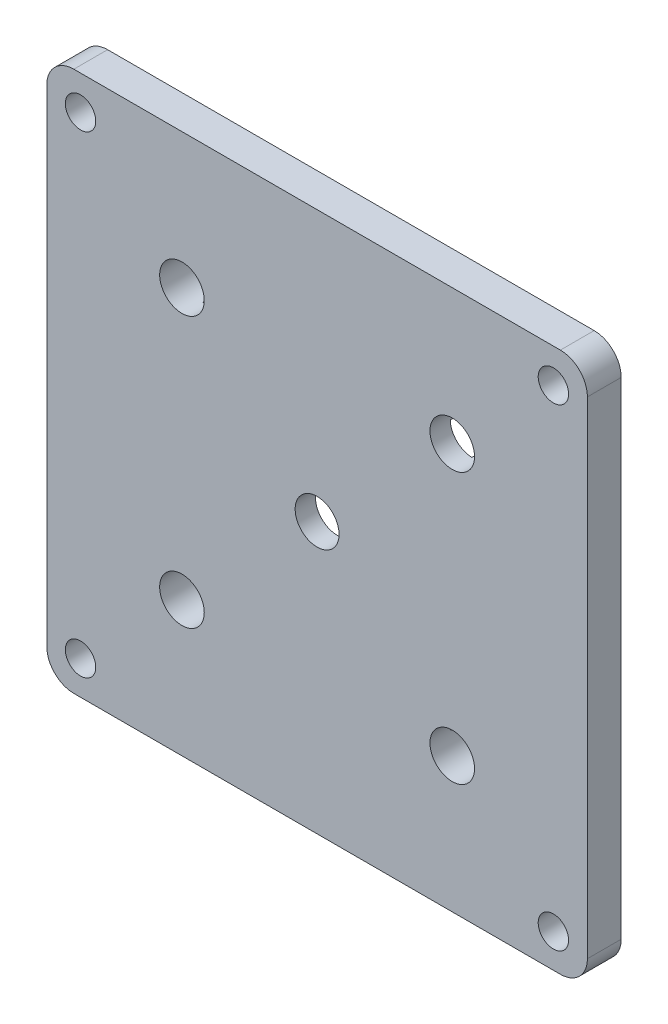
ISO-10303-21;
HEADER;
FILE_DESCRIPTION(('STEP AP214'),'2;1');
FILE_NAME('part.step','',(''),(''),'','','');
FILE_SCHEMA(('AUTOMOTIVE_DESIGN { 1 0 10303 214 1 1 1 1 }'));
ENDSEC;
DATA;
#1=APPLICATION_CONTEXT('core data for automotive mechanical design processes');
#2=APPLICATION_PROTOCOL_DEFINITION('international standard','automotive_design',2000,#1);
#3=PRODUCT_CONTEXT('',#1,'mechanical');
#4=PRODUCT('Part','Part','',(#3));
#5=PRODUCT_RELATED_PRODUCT_CATEGORY('part','',(#4));
#6=PRODUCT_DEFINITION_FORMATION('','',#4);
#7=PRODUCT_DEFINITION_CONTEXT('part definition',#1,'design');
#8=PRODUCT_DEFINITION('design','',#6,#7);
#9=PRODUCT_DEFINITION_SHAPE('','',#8);
#10=(LENGTH_UNIT() NAMED_UNIT(*) SI_UNIT(.MILLI.,.METRE.));
#11=(NAMED_UNIT(*) PLANE_ANGLE_UNIT() SI_UNIT($,.RADIAN.));
#12=(NAMED_UNIT(*) SI_UNIT($,.STERADIAN.) SOLID_ANGLE_UNIT());
#13=UNCERTAINTY_MEASURE_WITH_UNIT(LENGTH_MEASURE(1.E-05),#10,'distance_accuracy_value','');
#14=(GEOMETRIC_REPRESENTATION_CONTEXT(3) GLOBAL_UNCERTAINTY_ASSIGNED_CONTEXT((#13)) GLOBAL_UNIT_ASSIGNED_CONTEXT((#10,
#11,#12)) REPRESENTATION_CONTEXT('',''));
#15=CARTESIAN_POINT('',(0.,0.,0.));
#16=DIRECTION('',(0.,0.,1.));
#17=DIRECTION('',(1.,0.,0.));
#18=AXIS2_PLACEMENT_3D('',#15,#16,#17);
#19=CARTESIAN_POINT('',(0.,0.,5.));
#20=DIRECTION('',(0.,0.,-1.));
#21=DIRECTION('',(-1.,0.,0.));
#22=AXIS2_PLACEMENT_3D('',#19,#20,#21);
#23=CYLINDRICAL_SURFACE('',#22,3.25);
#24=CARTESIAN_POINT('',(0.,0.,5.));
#25=DIRECTION('',(0.,0.,-1.));
#26=DIRECTION('',(-1.,0.,0.));
#27=AXIS2_PLACEMENT_3D('',#24,#25,#26);
#28=CIRCLE('',#27,3.25);
#29=CARTESIAN_POINT('',(-3.25,0.,5.));
#30=VERTEX_POINT('',#29);
#31=EDGE_CURVE('E356',#30,#30,#28,.T.);
#32=ORIENTED_EDGE('',*,*,#31,.F.);
#33=EDGE_LOOP('',(#32));
#34=FACE_BOUND('',#33,.T.);
#35=CARTESIAN_POINT('',(0.,0.,2.));
#36=DIRECTION('',(0.,0.,-1.));
#37=DIRECTION('',(-1.,0.,0.));
#38=AXIS2_PLACEMENT_3D('',#35,#36,#37);
#39=CIRCLE('',#38,3.25);
#40=CARTESIAN_POINT('',(-3.25,0.,2.));
#41=VERTEX_POINT('',#40);
#42=EDGE_CURVE('E331',#41,#41,#39,.F.);
#43=ORIENTED_EDGE('',*,*,#42,.F.);
#44=EDGE_LOOP('',(#43));
#45=FACE_BOUND('',#44,.T.);
#46=ADVANCED_FACE('F33',(#34,#45),#23,.F.);
#47=CARTESIAN_POINT('',(-36.,-36.,0.));
#48=DIRECTION('',(0.,0.,-1.));
#49=DIRECTION('',(-1.,0.,0.));
#50=AXIS2_PLACEMENT_3D('',#47,#48,#49);
#51=PLANE('',#50);
#52=CARTESIAN_POINT('',(-16.0000000000088,-20.0000000000078,0.));
#53=CARTESIAN_POINT('',(-19.6568542495012,-19.6568542495002,0.));
#54=CARTESIAN_POINT('',(-20.0000000000089,-16.0000000000078,0.));
#55=B_SPLINE_CURVE_WITH_KNOTS('',2,(#52,#53,#54),.UNSPECIFIED.,.F.,.F.,(3,3),(0.,1.),.UNSPECIFIED.);
#56=CARTESIAN_POINT('',(-16.0000000000088,-20.0000000000078,0.));
#57=VERTEX_POINT('',#56);
#58=CARTESIAN_POINT('',(-16.7015906287883,-19.8975518674672,0.));
#59=VERTEX_POINT('',#58);
#60=EDGE_CURVE('E230',#57,#59,#55,.T.);
#61=ORIENTED_EDGE('',*,*,#60,.F.);
#62=CARTESIAN_POINT('',(15.9999999999911,-20.0000000000078,0.));
#63=CARTESIAN_POINT('',(-16.0000000000088,-20.0000000000078,0.));
#64=B_SPLINE_CURVE_WITH_KNOTS('',1,(#62,#63),.UNSPECIFIED.,.F.,.F.,(2,2),(0.,1.),.UNSPECIFIED.);
#65=CARTESIAN_POINT('',(15.9999999999911,-20.0000000000078,0.));
#66=VERTEX_POINT('',#65);
#67=EDGE_CURVE('E290',#66,#57,#64,.T.);
#68=ORIENTED_EDGE('',*,*,#67,.F.);
#69=CARTESIAN_POINT('',(19.9999999999912,-16.0000000000078,0.));
#70=CARTESIAN_POINT('',(19.6568542494835,-19.6568542495002,0.));
#71=CARTESIAN_POINT('',(15.9999999999911,-20.0000000000078,0.));
#72=B_SPLINE_CURVE_WITH_KNOTS('',2,(#69,#70,#71),.UNSPECIFIED.,.F.,.F.,(3,3),(0.,1.),.UNSPECIFIED.);
#73=CARTESIAN_POINT('',(16.7015906287757,-19.8975518674662,0.));
#74=VERTEX_POINT('',#73);
#75=EDGE_CURVE('E281',#74,#66,#72,.T.);
#76=ORIENTED_EDGE('',*,*,#75,.F.);
#77=CARTESIAN_POINT('',(19.9999999999937,-20.0000000000076,0.));
#78=DIRECTION('',(0.,0.,1.));
#79=DIRECTION('',(1.,0.,0.));
#80=AXIS2_PLACEMENT_3D('',#77,#78,#79);
#81=CIRCLE('',#80,3.3);
#82=CARTESIAN_POINT('',(19.8975518674501,-16.7015906287897,0.));
#83=VERTEX_POINT('',#82);
#84=EDGE_CURVE('E349',#74,#83,#81,.T.);
#85=ORIENTED_EDGE('',*,*,#84,.T.);
#86=CARTESIAN_POINT('',(19.9999999999912,-16.0000000000078,0.));
#87=VERTEX_POINT('',#86);
#88=EDGE_CURVE('E282',#87,#83,#72,.T.);
#89=ORIENTED_EDGE('',*,*,#88,.F.);
#90=CARTESIAN_POINT('',(19.9999999999912,15.9999999999922,0.));
#91=CARTESIAN_POINT('',(19.9999999999912,-16.0000000000078,0.));
#92=B_SPLINE_CURVE_WITH_KNOTS('',1,(#90,#91),.UNSPECIFIED.,.F.,.F.,(2,2),(0.,1.),.UNSPECIFIED.);
#93=CARTESIAN_POINT('',(19.9999999999912,15.9999999999922,0.));
#94=VERTEX_POINT('',#93);
#95=EDGE_CURVE('E273',#94,#87,#92,.T.);
#96=ORIENTED_EDGE('',*,*,#95,.F.);
#97=CARTESIAN_POINT('',(15.9999999999911,19.9999999999922,0.));
#98=CARTESIAN_POINT('',(19.6568542494835,19.6568542494846,0.));
#99=CARTESIAN_POINT('',(19.9999999999912,15.9999999999922,0.));
#100=B_SPLINE_CURVE_WITH_KNOTS('',2,(#97,#98,#99),.UNSPECIFIED.,.F.,.F.,(3,3),(0.,1.),.UNSPECIFIED.);
#101=CARTESIAN_POINT('',(19.89755186745,16.7015906287745,0.));
#102=VERTEX_POINT('',#101);
#103=EDGE_CURVE('E264',#102,#94,#100,.T.);
#104=ORIENTED_EDGE('',*,*,#103,.F.);
#105=CARTESIAN_POINT('',(19.9999999999937,19.9999999999924,0.));
#106=DIRECTION('',(0.,0.,1.));
#107=DIRECTION('',(1.,0.,0.));
#108=AXIS2_PLACEMENT_3D('',#105,#106,#107);
#109=CIRCLE('',#108,3.3);
#110=CARTESIAN_POINT('',(16.7015906287757,19.8975518674505,0.));
#111=VERTEX_POINT('',#110);
#112=EDGE_CURVE('E343',#102,#111,#109,.T.);
#113=ORIENTED_EDGE('',*,*,#112,.T.);
#114=CARTESIAN_POINT('',(15.9999999999911,19.9999999999922,0.));
#115=VERTEX_POINT('',#114);
#116=EDGE_CURVE('E265',#115,#111,#100,.T.);
#117=ORIENTED_EDGE('',*,*,#116,.F.);
#118=CARTESIAN_POINT('',(-16.0000000000088,19.9999999999922,0.));
#119=CARTESIAN_POINT('',(15.9999999999911,19.9999999999922,0.));
#120=B_SPLINE_CURVE_WITH_KNOTS('',1,(#118,#119),.UNSPECIFIED.,.F.,.F.,(2,2),(0.,1.),.UNSPECIFIED.);
#121=CARTESIAN_POINT('',(-16.0000000000088,19.9999999999922,0.));
#122=VERTEX_POINT('',#121);
#123=EDGE_CURVE('E256',#122,#115,#120,.T.);
#124=ORIENTED_EDGE('',*,*,#123,.F.);
#125=CARTESIAN_POINT('',(-20.0000000000089,15.9999999999922,0.));
#126=CARTESIAN_POINT('',(-19.6568542495012,19.6568542494845,0.));
#127=CARTESIAN_POINT('',(-16.0000000000088,19.9999999999922,0.));
#128=B_SPLINE_CURVE_WITH_KNOTS('',2,(#125,#126,#127),.UNSPECIFIED.,.F.,.F.,(3,3),(0.,1.),.UNSPECIFIED.);
#129=CARTESIAN_POINT('',(-16.7015906287883,19.8975518674515,0.));
#130=VERTEX_POINT('',#129);
#131=EDGE_CURVE('E247',#130,#122,#128,.T.);
#132=ORIENTED_EDGE('',*,*,#131,.F.);
#133=CARTESIAN_POINT('',(-20.0000000000063,19.9999999999924,0.));
#134=DIRECTION('',(0.,0.,1.));
#135=DIRECTION('',(1.,0.,0.));
#136=AXIS2_PLACEMENT_3D('',#133,#134,#135);
#137=CIRCLE('',#136,3.3);
#138=CARTESIAN_POINT('',(-19.8975518674677,16.7015906287743,0.));
#139=VERTEX_POINT('',#138);
#140=EDGE_CURVE('E337',#130,#139,#137,.T.);
#141=ORIENTED_EDGE('',*,*,#140,.T.);
#142=CARTESIAN_POINT('',(-20.0000000000089,15.9999999999922,0.));
#143=VERTEX_POINT('',#142);
#144=EDGE_CURVE('E248',#143,#139,#128,.T.);
#145=ORIENTED_EDGE('',*,*,#144,.F.);
#146=CARTESIAN_POINT('',(-20.0000000000089,-16.0000000000078,0.));
#147=CARTESIAN_POINT('',(-20.0000000000089,15.9999999999922,0.));
#148=B_SPLINE_CURVE_WITH_KNOTS('',1,(#146,#147),.UNSPECIFIED.,.F.,.F.,(2,2),(0.,1.),.UNSPECIFIED.);
#149=CARTESIAN_POINT('',(-20.0000000000089,-16.0000000000078,0.));
#150=VERTEX_POINT('',#149);
#151=EDGE_CURVE('E229',#150,#143,#148,.T.);
#152=ORIENTED_EDGE('',*,*,#151,.F.);
#153=CARTESIAN_POINT('',(-19.8975518674678,-16.7015906287895,0.));
#154=VERTEX_POINT('',#153);
#155=EDGE_CURVE('E215',#154,#150,#55,.T.);
#156=ORIENTED_EDGE('',*,*,#155,.F.);
#157=CARTESIAN_POINT('',(-20.0000000000063,-20.0000000000076,0.));
#158=DIRECTION('',(0.,0.,1.));
#159=DIRECTION('',(1.,0.,0.));
#160=AXIS2_PLACEMENT_3D('',#157,#158,#159);
#161=CIRCLE('',#160,3.3);
#162=EDGE_CURVE('E205',#154,#59,#161,.T.);
#163=ORIENTED_EDGE('',*,*,#162,.T.);
#164=EDGE_LOOP('',(#61,#68,#76,#85,#89,#96,#104,#113,#117,#124,#132,#141,#145,#152,#156,#163));
#165=FACE_BOUND('',#164,.T.);
#166=CARTESIAN_POINT('',(-35.0076226985769,-35.023881332582,0.));
#167=DIRECTION('',(0.,0.,1.));
#168=DIRECTION('',(1.,0.,0.));
#169=AXIS2_PLACEMENT_3D('',#166,#167,#168);
#170=CIRCLE('',#169,2.24999999999999);
#171=CARTESIAN_POINT('',(-32.7576226985769,-35.023881332582,0.));
#172=VERTEX_POINT('',#171);
#173=EDGE_CURVE('E146',#172,#172,#170,.T.);
#174=ORIENTED_EDGE('',*,*,#173,.T.);
#175=EDGE_LOOP('',(#174));
#176=FACE_BOUND('',#175,.T.);
#177=CARTESIAN_POINT('',(-36.,-36.,0.));
#178=DIRECTION('',(0.,0.,1.));
#179=DIRECTION('',(-1.,0.,0.));
#180=AXIS2_PLACEMENT_3D('',#177,#178,#179);
#181=CIRCLE('',#180,4.);
#182=CARTESIAN_POINT('',(-40.,-36.,0.));
#183=VERTEX_POINT('',#182);
#184=CARTESIAN_POINT('',(-36.,-40.,0.));
#185=VERTEX_POINT('',#184);
#186=EDGE_CURVE('E142',#183,#185,#181,.T.);
#187=ORIENTED_EDGE('',*,*,#186,.F.);
#188=DIRECTION('',(0.,-1.,0.));
#189=VECTOR('',#188,1.);
#190=CARTESIAN_POINT('',(-40.,-36.,0.));
#191=LINE('',#190,#189);
#192=CARTESIAN_POINT('',(-40.,36.,0.));
#193=VERTEX_POINT('',#192);
#194=EDGE_CURVE('E90',#193,#183,#191,.T.);
#195=ORIENTED_EDGE('',*,*,#194,.F.);
#196=CARTESIAN_POINT('',(-36.,36.,0.));
#197=DIRECTION('',(0.,0.,1.));
#198=DIRECTION('',(-1.,0.,0.));
#199=AXIS2_PLACEMENT_3D('',#196,#197,#198);
#200=CIRCLE('',#199,4.);
#201=CARTESIAN_POINT('',(-36.,40.,0.));
#202=VERTEX_POINT('',#201);
#203=EDGE_CURVE('E155',#202,#193,#200,.T.);
#204=ORIENTED_EDGE('',*,*,#203,.F.);
#205=DIRECTION('',(-1.,0.,0.));
#206=VECTOR('',#205,1.);
#207=CARTESIAN_POINT('',(-36.,40.,0.));
#208=LINE('',#207,#206);
#209=CARTESIAN_POINT('',(36.,40.,0.));
#210=VERTEX_POINT('',#209);
#211=EDGE_CURVE('E130',#210,#202,#208,.T.);
#212=ORIENTED_EDGE('',*,*,#211,.F.);
#213=CARTESIAN_POINT('',(36.,36.,0.));
#214=DIRECTION('',(0.,0.,1.));
#215=DIRECTION('',(1.,0.,0.));
#216=AXIS2_PLACEMENT_3D('',#213,#214,#215);
#217=CIRCLE('',#216,4.);
#218=CARTESIAN_POINT('',(40.,36.,0.));
#219=VERTEX_POINT('',#218);
#220=EDGE_CURVE('E152',#219,#210,#217,.T.);
#221=ORIENTED_EDGE('',*,*,#220,.F.);
#222=DIRECTION('',(0.,1.,0.));
#223=VECTOR('',#222,1.);
#224=CARTESIAN_POINT('',(40.,-36.,0.));
#225=LINE('',#224,#223);
#226=CARTESIAN_POINT('',(40.,-36.,0.));
#227=VERTEX_POINT('',#226);
#228=EDGE_CURVE('E150',#227,#219,#225,.T.);
#229=ORIENTED_EDGE('',*,*,#228,.F.);
#230=CARTESIAN_POINT('',(36.,-36.,0.));
#231=DIRECTION('',(0.,0.,1.));
#232=DIRECTION('',(1.,0.,0.));
#233=AXIS2_PLACEMENT_3D('',#230,#231,#232);
#234=CIRCLE('',#233,4.);
#235=CARTESIAN_POINT('',(36.,-40.,0.));
#236=VERTEX_POINT('',#235);
#237=EDGE_CURVE('E148',#236,#227,#234,.T.);
#238=ORIENTED_EDGE('',*,*,#237,.F.);
#239=DIRECTION('',(1.,0.,0.));
#240=VECTOR('',#239,1.);
#241=CARTESIAN_POINT('',(-36.,-40.,0.));
#242=LINE('',#241,#240);
#243=EDGE_CURVE('E145',#185,#236,#242,.T.);
#244=ORIENTED_EDGE('',*,*,#243,.F.);
#245=EDGE_LOOP('',(#187,#195,#204,#212,#221,#229,#238,#244));
#246=FACE_BOUND('',#245,.T.);
#247=CARTESIAN_POINT('',(34.9683536446482,-35.0238813325822,0.));
#248=DIRECTION('',(0.,0.,1.));
#249=DIRECTION('',(1.,0.,0.));
#250=AXIS2_PLACEMENT_3D('',#247,#248,#249);
#251=CIRCLE('',#250,2.24999999999999);
#252=CARTESIAN_POINT('',(37.2183536446482,-35.0238813325822,0.));
#253=VERTEX_POINT('',#252);
#254=EDGE_CURVE('E374',#253,#253,#251,.T.);
#255=ORIENTED_EDGE('',*,*,#254,.T.);
#256=EDGE_LOOP('',(#255));
#257=FACE_BOUND('',#256,.T.);
#258=CARTESIAN_POINT('',(34.9683536446484,34.9623801641172,0.));
#259=DIRECTION('',(0.,0.,1.));
#260=DIRECTION('',(1.,0.,0.));
#261=AXIS2_PLACEMENT_3D('',#258,#259,#260);
#262=CIRCLE('',#261,2.24999999999999);
#263=CARTESIAN_POINT('',(37.2183536446484,34.9623801641172,0.));
#264=VERTEX_POINT('',#263);
#265=EDGE_CURVE('E368',#264,#264,#262,.T.);
#266=ORIENTED_EDGE('',*,*,#265,.T.);
#267=EDGE_LOOP('',(#266));
#268=FACE_BOUND('',#267,.T.);
#269=CARTESIAN_POINT('',(-35.0076226985767,34.9623801641174,0.));
#270=DIRECTION('',(0.,0.,1.));
#271=DIRECTION('',(1.,0.,0.));
#272=AXIS2_PLACEMENT_3D('',#269,#270,#271);
#273=CIRCLE('',#272,2.24999999999999);
#274=CARTESIAN_POINT('',(-32.7576226985767,34.9623801641174,0.));
#275=VERTEX_POINT('',#274);
#276=EDGE_CURVE('E362',#275,#275,#273,.T.);
#277=ORIENTED_EDGE('',*,*,#276,.T.);
#278=EDGE_LOOP('',(#277));
#279=FACE_BOUND('',#278,.T.);
#280=ADVANCED_FACE('F225',(#165,#176,#246,#257,#268,#279),#51,.T.);
#281=CARTESIAN_POINT('',(-36.,-36.,5.));
#282=DIRECTION('',(0.,0.,-1.));
#283=DIRECTION('',(-1.,0.,0.));
#284=AXIS2_PLACEMENT_3D('',#281,#282,#283);
#285=CYLINDRICAL_SURFACE('',#284,4.);
#286=ORIENTED_EDGE('',*,*,#186,.T.);
#287=DIRECTION('',(0.,0.,-1.));
#288=VECTOR('',#287,1.);
#289=CARTESIAN_POINT('',(-36.,-40.,5.));
#290=LINE('',#289,#288);
#291=CARTESIAN_POINT('',(-36.,-40.,5.));
#292=VERTEX_POINT('',#291);
#293=EDGE_CURVE('E171',#292,#185,#290,.T.);
#294=ORIENTED_EDGE('',*,*,#293,.F.);
#295=CARTESIAN_POINT('',(-36.,-36.,5.));
#296=DIRECTION('',(0.,0.,1.));
#297=DIRECTION('',(-1.,0.,0.));
#298=AXIS2_PLACEMENT_3D('',#295,#296,#297);
#299=CIRCLE('',#298,4.);
#300=CARTESIAN_POINT('',(-40.,-36.,5.));
#301=VERTEX_POINT('',#300);
#302=EDGE_CURVE('E158',#301,#292,#299,.T.);
#303=ORIENTED_EDGE('',*,*,#302,.F.);
#304=DIRECTION('',(0.,0.,-1.));
#305=VECTOR('',#304,1.);
#306=CARTESIAN_POINT('',(-40.,-36.,5.));
#307=LINE('',#306,#305);
#308=EDGE_CURVE('E138',#301,#183,#307,.T.);
#309=ORIENTED_EDGE('',*,*,#308,.T.);
#310=EDGE_LOOP('',(#286,#294,#303,#309));
#311=FACE_BOUND('',#310,.T.);
#312=ADVANCED_FACE('F35',(#311),#285,.T.);
#313=CARTESIAN_POINT('',(-36.,-40.,5.));
#314=DIRECTION('',(0.,1.,0.));
#315=DIRECTION('',(0.,0.,1.));
#316=AXIS2_PLACEMENT_3D('',#313,#314,#315);
#317=PLANE('',#316);
#318=ORIENTED_EDGE('',*,*,#243,.T.);
#319=DIRECTION('',(0.,0.,-1.));
#320=VECTOR('',#319,1.);
#321=CARTESIAN_POINT('',(36.,-40.,5.));
#322=LINE('',#321,#320);
#323=CARTESIAN_POINT('',(36.,-40.,5.));
#324=VERTEX_POINT('',#323);
#325=EDGE_CURVE('E168',#324,#236,#322,.T.);
#326=ORIENTED_EDGE('',*,*,#325,.F.);
#327=DIRECTION('',(1.,0.,0.));
#328=VECTOR('',#327,1.);
#329=CARTESIAN_POINT('',(-36.,-40.,5.));
#330=LINE('',#329,#328);
#331=EDGE_CURVE('E99',#292,#324,#330,.T.);
#332=ORIENTED_EDGE('',*,*,#331,.F.);
#333=ORIENTED_EDGE('',*,*,#293,.T.);
#334=EDGE_LOOP('',(#318,#326,#332,#333));
#335=FACE_BOUND('',#334,.T.);
#336=ADVANCED_FACE('F404',(#335),#317,.F.);
#337=CARTESIAN_POINT('',(36.,-36.,5.));
#338=DIRECTION('',(0.,0.,-1.));
#339=DIRECTION('',(-1.,0.,0.));
#340=AXIS2_PLACEMENT_3D('',#337,#338,#339);
#341=CYLINDRICAL_SURFACE('',#340,4.);
#342=ORIENTED_EDGE('',*,*,#237,.T.);
#343=DIRECTION('',(0.,0.,-1.));
#344=VECTOR('',#343,1.);
#345=CARTESIAN_POINT('',(40.,-36.,5.));
#346=LINE('',#345,#344);
#347=CARTESIAN_POINT('',(40.,-36.,5.));
#348=VERTEX_POINT('',#347);
#349=EDGE_CURVE('E165',#348,#227,#346,.T.);
#350=ORIENTED_EDGE('',*,*,#349,.F.);
#351=CARTESIAN_POINT('',(36.,-36.,5.));
#352=DIRECTION('',(0.,0.,1.));
#353=DIRECTION('',(1.,0.,0.));
#354=AXIS2_PLACEMENT_3D('',#351,#352,#353);
#355=CIRCLE('',#354,4.);
#356=EDGE_CURVE('E384',#324,#348,#355,.T.);
#357=ORIENTED_EDGE('',*,*,#356,.F.);
#358=ORIENTED_EDGE('',*,*,#325,.T.);
#359=EDGE_LOOP('',(#342,#350,#357,#358));
#360=FACE_BOUND('',#359,.T.);
#361=ADVANCED_FACE('F407',(#360),#341,.T.);
#362=CARTESIAN_POINT('',(40.,-36.,5.));
#363=DIRECTION('',(-1.,0.,0.));
#364=DIRECTION('',(0.,0.,1.));
#365=AXIS2_PLACEMENT_3D('',#362,#363,#364);
#366=PLANE('',#365);
#367=ORIENTED_EDGE('',*,*,#228,.T.);
#368=DIRECTION('',(0.,0.,-1.));
#369=VECTOR('',#368,1.);
#370=CARTESIAN_POINT('',(40.,36.,5.));
#371=LINE('',#370,#369);
#372=CARTESIAN_POINT('',(40.,36.,5.));
#373=VERTEX_POINT('',#372);
#374=EDGE_CURVE('E162',#373,#219,#371,.T.);
#375=ORIENTED_EDGE('',*,*,#374,.F.);
#376=DIRECTION('',(0.,1.,0.));
#377=VECTOR('',#376,1.);
#378=CARTESIAN_POINT('',(40.,-36.,5.));
#379=LINE('',#378,#377);
#380=EDGE_CURVE('E386',#348,#373,#379,.T.);
#381=ORIENTED_EDGE('',*,*,#380,.F.);
#382=ORIENTED_EDGE('',*,*,#349,.T.);
#383=EDGE_LOOP('',(#367,#375,#381,#382));
#384=FACE_BOUND('',#383,.T.);
#385=ADVANCED_FACE('F392',(#384),#366,.F.);
#386=CARTESIAN_POINT('',(36.,36.,5.));
#387=DIRECTION('',(0.,0.,-1.));
#388=DIRECTION('',(-1.,0.,0.));
#389=AXIS2_PLACEMENT_3D('',#386,#387,#388);
#390=CYLINDRICAL_SURFACE('',#389,4.);
#391=ORIENTED_EDGE('',*,*,#220,.T.);
#392=DIRECTION('',(0.,0.,-1.));
#393=VECTOR('',#392,1.);
#394=CARTESIAN_POINT('',(36.,40.,5.));
#395=LINE('',#394,#393);
#396=CARTESIAN_POINT('',(36.,40.,5.));
#397=VERTEX_POINT('',#396);
#398=EDGE_CURVE('E133',#397,#210,#395,.T.);
#399=ORIENTED_EDGE('',*,*,#398,.F.);
#400=CARTESIAN_POINT('',(36.,36.,5.));
#401=DIRECTION('',(0.,0.,1.));
#402=DIRECTION('',(1.,0.,0.));
#403=AXIS2_PLACEMENT_3D('',#400,#401,#402);
#404=CIRCLE('',#403,4.);
#405=EDGE_CURVE('E121',#373,#397,#404,.T.);
#406=ORIENTED_EDGE('',*,*,#405,.F.);
#407=ORIENTED_EDGE('',*,*,#374,.T.);
#408=EDGE_LOOP('',(#391,#399,#406,#407));
#409=FACE_BOUND('',#408,.T.);
#410=ADVANCED_FACE('F396',(#409),#390,.T.);
#411=CARTESIAN_POINT('',(-36.,40.,5.));
#412=DIRECTION('',(0.,-1.,0.));
#413=DIRECTION('',(0.,0.,-1.));
#414=AXIS2_PLACEMENT_3D('',#411,#412,#413);
#415=PLANE('',#414);
#416=ORIENTED_EDGE('',*,*,#211,.T.);
#417=DIRECTION('',(0.,0.,-1.));
#418=VECTOR('',#417,1.);
#419=CARTESIAN_POINT('',(-36.,40.,5.));
#420=LINE('',#419,#418);
#421=CARTESIAN_POINT('',(-36.,40.,5.));
#422=VERTEX_POINT('',#421);
#423=EDGE_CURVE('E127',#422,#202,#420,.T.);
#424=ORIENTED_EDGE('',*,*,#423,.F.);
#425=DIRECTION('',(-1.,0.,0.));
#426=VECTOR('',#425,1.);
#427=CARTESIAN_POINT('',(-36.,40.,5.));
#428=LINE('',#427,#426);
#429=EDGE_CURVE('E114',#397,#422,#428,.T.);
#430=ORIENTED_EDGE('',*,*,#429,.F.);
#431=ORIENTED_EDGE('',*,*,#398,.T.);
#432=EDGE_LOOP('',(#416,#424,#430,#431));
#433=FACE_BOUND('',#432,.T.);
#434=ADVANCED_FACE('F128',(#433),#415,.F.);
#435=CARTESIAN_POINT('',(-36.,36.,5.));
#436=DIRECTION('',(0.,0.,-1.));
#437=DIRECTION('',(-1.,0.,0.));
#438=AXIS2_PLACEMENT_3D('',#435,#436,#437);
#439=CYLINDRICAL_SURFACE('',#438,4.);
#440=ORIENTED_EDGE('',*,*,#203,.T.);
#441=DIRECTION('',(0.,0.,-1.));
#442=VECTOR('',#441,1.);
#443=CARTESIAN_POINT('',(-40.,36.,5.));
#444=LINE('',#443,#442);
#445=CARTESIAN_POINT('',(-40.,36.,5.));
#446=VERTEX_POINT('',#445);
#447=EDGE_CURVE('E134',#446,#193,#444,.T.);
#448=ORIENTED_EDGE('',*,*,#447,.F.);
#449=CARTESIAN_POINT('',(-36.,36.,5.));
#450=DIRECTION('',(0.,0.,1.));
#451=DIRECTION('',(-1.,0.,0.));
#452=AXIS2_PLACEMENT_3D('',#449,#450,#451);
#453=CIRCLE('',#452,4.);
#454=EDGE_CURVE('E118',#422,#446,#453,.T.);
#455=ORIENTED_EDGE('',*,*,#454,.F.);
#456=ORIENTED_EDGE('',*,*,#423,.T.);
#457=EDGE_LOOP('',(#440,#448,#455,#456));
#458=FACE_BOUND('',#457,.T.);
#459=ADVANCED_FACE('F136',(#458),#439,.T.);
#460=CARTESIAN_POINT('',(-40.,-36.,5.));
#461=DIRECTION('',(1.,0.,0.));
#462=DIRECTION('',(0.,0.,-1.));
#463=AXIS2_PLACEMENT_3D('',#460,#461,#462);
#464=PLANE('',#463);
#465=ORIENTED_EDGE('',*,*,#194,.T.);
#466=ORIENTED_EDGE('',*,*,#308,.F.);
#467=DIRECTION('',(0.,-1.,0.));
#468=VECTOR('',#467,1.);
#469=CARTESIAN_POINT('',(-40.,-36.,5.));
#470=LINE('',#469,#468);
#471=EDGE_CURVE('E57',#446,#301,#470,.T.);
#472=ORIENTED_EDGE('',*,*,#471,.F.);
#473=ORIENTED_EDGE('',*,*,#447,.T.);
#474=EDGE_LOOP('',(#465,#466,#472,#473));
#475=FACE_BOUND('',#474,.T.);
#476=ADVANCED_FACE('F400',(#475),#464,.F.);
#477=CARTESIAN_POINT('',(-36.,-36.,5.));
#478=DIRECTION('',(0.,0.,-1.));
#479=DIRECTION('',(-1.,0.,0.));
#480=AXIS2_PLACEMENT_3D('',#477,#478,#479);
#481=PLANE('',#480);
#482=CARTESIAN_POINT('',(-20.0000000000063,19.9999999999924,5.));
#483=DIRECTION('',(0.,0.,1.));
#484=DIRECTION('',(1.,0.,0.));
#485=AXIS2_PLACEMENT_3D('',#482,#483,#484);
#486=CIRCLE('',#485,3.29999999999999);
#487=CARTESIAN_POINT('',(-16.7000000000063,19.9999999999924,5.));
#488=VERTEX_POINT('',#487);
#489=EDGE_CURVE('E334',#488,#488,#486,.T.);
#490=ORIENTED_EDGE('',*,*,#489,.F.);
#491=EDGE_LOOP('',(#490));
#492=FACE_BOUND('',#491,.T.);
#493=CARTESIAN_POINT('',(19.9999999999937,19.9999999999924,5.));
#494=DIRECTION('',(0.,0.,1.));
#495=DIRECTION('',(1.,0.,0.));
#496=AXIS2_PLACEMENT_3D('',#493,#494,#495);
#497=CIRCLE('',#496,3.29999999999999);
#498=CARTESIAN_POINT('',(23.2999999999937,19.9999999999924,5.));
#499=VERTEX_POINT('',#498);
#500=EDGE_CURVE('E340',#499,#499,#497,.T.);
#501=ORIENTED_EDGE('',*,*,#500,.F.);
#502=EDGE_LOOP('',(#501));
#503=FACE_BOUND('',#502,.T.);
#504=CARTESIAN_POINT('',(19.9999999999937,-20.0000000000076,5.));
#505=DIRECTION('',(0.,0.,1.));
#506=DIRECTION('',(1.,0.,0.));
#507=AXIS2_PLACEMENT_3D('',#504,#505,#506);
#508=CIRCLE('',#507,3.29999999999999);
#509=CARTESIAN_POINT('',(23.2999999999937,-20.0000000000076,5.));
#510=VERTEX_POINT('',#509);
#511=EDGE_CURVE('E346',#510,#510,#508,.T.);
#512=ORIENTED_EDGE('',*,*,#511,.F.);
#513=EDGE_LOOP('',(#512));
#514=FACE_BOUND('',#513,.T.);
#515=CARTESIAN_POINT('',(-20.0000000000063,-20.0000000000076,5.));
#516=DIRECTION('',(0.,0.,1.));
#517=DIRECTION('',(1.,0.,0.));
#518=AXIS2_PLACEMENT_3D('',#515,#516,#517);
#519=CIRCLE('',#518,3.29999999999999);
#520=CARTESIAN_POINT('',(-16.7000000000063,-20.0000000000076,5.));
#521=VERTEX_POINT('',#520);
#522=EDGE_CURVE('E352',#521,#521,#519,.T.);
#523=ORIENTED_EDGE('',*,*,#522,.F.);
#524=EDGE_LOOP('',(#523));
#525=FACE_BOUND('',#524,.T.);
#526=ORIENTED_EDGE('',*,*,#31,.T.);
#527=EDGE_LOOP('',(#526));
#528=FACE_BOUND('',#527,.T.);
#529=CARTESIAN_POINT('',(-35.0076226985767,34.9623801641174,5.));
#530=DIRECTION('',(0.,0.,1.));
#531=DIRECTION('',(1.,0.,0.));
#532=AXIS2_PLACEMENT_3D('',#529,#530,#531);
#533=CIRCLE('',#532,2.24999999999999);
#534=CARTESIAN_POINT('',(-32.7576226985767,34.9623801641174,5.));
#535=VERTEX_POINT('',#534);
#536=EDGE_CURVE('E359',#535,#535,#533,.T.);
#537=ORIENTED_EDGE('',*,*,#536,.F.);
#538=EDGE_LOOP('',(#537));
#539=FACE_BOUND('',#538,.T.);
#540=CARTESIAN_POINT('',(34.9683536446484,34.9623801641172,5.));
#541=DIRECTION('',(0.,0.,1.));
#542=DIRECTION('',(1.,0.,0.));
#543=AXIS2_PLACEMENT_3D('',#540,#541,#542);
#544=CIRCLE('',#543,2.24999999999999);
#545=CARTESIAN_POINT('',(37.2183536446484,34.9623801641172,5.));
#546=VERTEX_POINT('',#545);
#547=EDGE_CURVE('E365',#546,#546,#544,.T.);
#548=ORIENTED_EDGE('',*,*,#547,.F.);
#549=EDGE_LOOP('',(#548));
#550=FACE_BOUND('',#549,.T.);
#551=CARTESIAN_POINT('',(34.9683536446482,-35.0238813325822,5.));
#552=DIRECTION('',(0.,0.,1.));
#553=DIRECTION('',(1.,0.,0.));
#554=AXIS2_PLACEMENT_3D('',#551,#552,#553);
#555=CIRCLE('',#554,2.24999999999999);
#556=CARTESIAN_POINT('',(37.2183536446482,-35.0238813325822,5.));
#557=VERTEX_POINT('',#556);
#558=EDGE_CURVE('E371',#557,#557,#555,.T.);
#559=ORIENTED_EDGE('',*,*,#558,.F.);
#560=EDGE_LOOP('',(#559));
#561=FACE_BOUND('',#560,.T.);
#562=CARTESIAN_POINT('',(-35.0076226985769,-35.023881332582,5.));
#563=DIRECTION('',(0.,0.,1.));
#564=DIRECTION('',(1.,0.,0.));
#565=AXIS2_PLACEMENT_3D('',#562,#563,#564);
#566=CIRCLE('',#565,2.24999999999999);
#567=CARTESIAN_POINT('',(-32.7576226985769,-35.023881332582,5.));
#568=VERTEX_POINT('',#567);
#569=EDGE_CURVE('E377',#568,#568,#566,.T.);
#570=ORIENTED_EDGE('',*,*,#569,.F.);
#571=EDGE_LOOP('',(#570));
#572=FACE_BOUND('',#571,.T.);
#573=ORIENTED_EDGE('',*,*,#302,.T.);
#574=ORIENTED_EDGE('',*,*,#331,.T.);
#575=ORIENTED_EDGE('',*,*,#356,.T.);
#576=ORIENTED_EDGE('',*,*,#380,.T.);
#577=ORIENTED_EDGE('',*,*,#405,.T.);
#578=ORIENTED_EDGE('',*,*,#429,.T.);
#579=ORIENTED_EDGE('',*,*,#454,.T.);
#580=ORIENTED_EDGE('',*,*,#471,.T.);
#581=EDGE_LOOP('',(#573,#574,#575,#576,#577,#578,#579,#580));
#582=FACE_BOUND('',#581,.T.);
#583=ADVANCED_FACE('F116',(#492,#503,#514,#525,#528,#539,#550,#561,#572,#582),#481,.F.);
#584=CARTESIAN_POINT('',(-35.0076226985769,-35.023881332582,5.));
#585=DIRECTION('',(0.,0.,1.));
#586=DIRECTION('',(1.,0.,0.));
#587=AXIS2_PLACEMENT_3D('',#584,#585,#586);
#588=CYLINDRICAL_SURFACE('',#587,2.24999999999999);
#589=ORIENTED_EDGE('',*,*,#173,.F.);
#590=EDGE_LOOP('',(#589));
#591=FACE_BOUND('',#590,.T.);
#592=ORIENTED_EDGE('',*,*,#569,.T.);
#593=EDGE_LOOP('',(#592));
#594=FACE_BOUND('',#593,.T.);
#595=ADVANCED_FACE('F440',(#591,#594),#588,.F.);
#596=CARTESIAN_POINT('',(34.9683536446482,-35.0238813325822,5.));
#597=DIRECTION('',(0.,0.,1.));
#598=DIRECTION('',(1.,0.,0.));
#599=AXIS2_PLACEMENT_3D('',#596,#597,#598);
#600=CYLINDRICAL_SURFACE('',#599,2.24999999999999);
#601=ORIENTED_EDGE('',*,*,#254,.F.);
#602=EDGE_LOOP('',(#601));
#603=FACE_BOUND('',#602,.T.);
#604=ORIENTED_EDGE('',*,*,#558,.T.);
#605=EDGE_LOOP('',(#604));
#606=FACE_BOUND('',#605,.T.);
#607=ADVANCED_FACE('F436',(#603,#606),#600,.F.);
#608=CARTESIAN_POINT('',(34.9683536446484,34.9623801641172,5.));
#609=DIRECTION('',(0.,0.,1.));
#610=DIRECTION('',(1.,0.,0.));
#611=AXIS2_PLACEMENT_3D('',#608,#609,#610);
#612=CYLINDRICAL_SURFACE('',#611,2.24999999999999);
#613=ORIENTED_EDGE('',*,*,#265,.F.);
#614=EDGE_LOOP('',(#613));
#615=FACE_BOUND('',#614,.T.);
#616=ORIENTED_EDGE('',*,*,#547,.T.);
#617=EDGE_LOOP('',(#616));
#618=FACE_BOUND('',#617,.T.);
#619=ADVANCED_FACE('F432',(#615,#618),#612,.F.);
#620=CARTESIAN_POINT('',(-35.0076226985767,34.9623801641174,5.));
#621=DIRECTION('',(0.,0.,1.));
#622=DIRECTION('',(1.,0.,0.));
#623=AXIS2_PLACEMENT_3D('',#620,#621,#622);
#624=CYLINDRICAL_SURFACE('',#623,2.24999999999999);
#625=ORIENTED_EDGE('',*,*,#276,.F.);
#626=EDGE_LOOP('',(#625));
#627=FACE_BOUND('',#626,.T.);
#628=ORIENTED_EDGE('',*,*,#536,.T.);
#629=EDGE_LOOP('',(#628));
#630=FACE_BOUND('',#629,.T.);
#631=ADVANCED_FACE('F429',(#627,#630),#624,.F.);
#632=CARTESIAN_POINT('',(-20.0000000000063,-20.0000000000076,5.));
#633=DIRECTION('',(0.,0.,1.));
#634=DIRECTION('',(1.,0.,0.));
#635=AXIS2_PLACEMENT_3D('',#632,#633,#634);
#636=CYLINDRICAL_SURFACE('',#635,3.29999999999999);
#637=CARTESIAN_POINT('',(-20.0000000000063,-20.0000000000076,2.));
#638=DIRECTION('',(0.,0.,-1.));
#639=DIRECTION('',(-1.,0.,0.));
#640=AXIS2_PLACEMENT_3D('',#637,#638,#639);
#641=CIRCLE('',#640,3.29999999999999);
#642=CARTESIAN_POINT('',(-16.7015906287883,-19.8975518674672,2.));
#643=VERTEX_POINT('',#642);
#644=CARTESIAN_POINT('',(-19.8975518674678,-16.7015906287895,2.));
#645=VERTEX_POINT('',#644);
#646=EDGE_CURVE('E202',#643,#645,#641,.F.);
#647=ORIENTED_EDGE('',*,*,#646,.F.);
#648=DIRECTION('',(0.,0.,-1.));
#649=VECTOR('',#648,1.);
#650=CARTESIAN_POINT('',(-16.7015906287883,-19.8975518674672,2.));
#651=LINE('',#650,#649);
#652=EDGE_CURVE('E11',#643,#59,#651,.T.);
#653=ORIENTED_EDGE('',*,*,#652,.T.);
#654=ORIENTED_EDGE('',*,*,#162,.F.);
#655=DIRECTION('',(0.,0.,-1.));
#656=VECTOR('',#655,1.);
#657=CARTESIAN_POINT('',(-19.8975518674678,-16.7015906287895,2.));
#658=LINE('',#657,#656);
#659=EDGE_CURVE('E41',#154,#645,#658,.F.);
#660=ORIENTED_EDGE('',*,*,#659,.T.);
#661=EDGE_LOOP('',(#647,#653,#654,#660));
#662=FACE_BOUND('',#661,.T.);
#663=ORIENTED_EDGE('',*,*,#522,.T.);
#664=EDGE_LOOP('',(#663));
#665=FACE_BOUND('',#664,.T.);
#666=ADVANCED_FACE('F198',(#662,#665),#636,.F.);
#667=CARTESIAN_POINT('',(19.9999999999937,-20.0000000000076,5.));
#668=DIRECTION('',(0.,0.,1.));
#669=DIRECTION('',(1.,0.,0.));
#670=AXIS2_PLACEMENT_3D('',#667,#668,#669);
#671=CYLINDRICAL_SURFACE('',#670,3.29999999999999);
#672=CARTESIAN_POINT('',(19.9999999999937,-20.0000000000076,2.));
#673=DIRECTION('',(0.,0.,-1.));
#674=DIRECTION('',(-1.,0.,0.));
#675=AXIS2_PLACEMENT_3D('',#672,#673,#674);
#676=CIRCLE('',#675,3.29999999999999);
#677=CARTESIAN_POINT('',(19.8975518674501,-16.7015906287897,2.));
#678=VERTEX_POINT('',#677);
#679=CARTESIAN_POINT('',(16.7015906287757,-19.8975518674662,2.));
#680=VERTEX_POINT('',#679);
#681=EDGE_CURVE('E327',#678,#680,#676,.F.);
#682=ORIENTED_EDGE('',*,*,#681,.F.);
#683=DIRECTION('',(0.,0.,-1.));
#684=VECTOR('',#683,1.);
#685=CARTESIAN_POINT('',(19.8975518674501,-16.7015906287897,2.));
#686=LINE('',#685,#684);
#687=EDGE_CURVE('E190',#678,#83,#686,.T.);
#688=ORIENTED_EDGE('',*,*,#687,.T.);
#689=ORIENTED_EDGE('',*,*,#84,.F.);
#690=DIRECTION('',(0.,0.,-1.));
#691=VECTOR('',#690,1.);
#692=CARTESIAN_POINT('',(16.7015906287757,-19.8975518674662,2.));
#693=LINE('',#692,#691);
#694=EDGE_CURVE('E187',#74,#680,#693,.F.);
#695=ORIENTED_EDGE('',*,*,#694,.T.);
#696=EDGE_LOOP('',(#682,#688,#689,#695));
#697=FACE_BOUND('',#696,.T.);
#698=ORIENTED_EDGE('',*,*,#511,.T.);
#699=EDGE_LOOP('',(#698));
#700=FACE_BOUND('',#699,.T.);
#701=ADVANCED_FACE('F506',(#697,#700),#671,.F.);
#702=CARTESIAN_POINT('',(19.9999999999937,19.9999999999924,5.));
#703=DIRECTION('',(0.,0.,1.));
#704=DIRECTION('',(1.,0.,0.));
#705=AXIS2_PLACEMENT_3D('',#702,#703,#704);
#706=CYLINDRICAL_SURFACE('',#705,3.29999999999999);
#707=CARTESIAN_POINT('',(19.9999999999937,19.9999999999924,2.));
#708=DIRECTION('',(0.,0.,-1.));
#709=DIRECTION('',(-1.,0.,0.));
#710=AXIS2_PLACEMENT_3D('',#707,#708,#709);
#711=CIRCLE('',#710,3.29999999999999);
#712=CARTESIAN_POINT('',(16.7015906287757,19.8975518674505,2.));
#713=VERTEX_POINT('',#712);
#714=CARTESIAN_POINT('',(19.89755186745,16.7015906287745,2.));
#715=VERTEX_POINT('',#714);
#716=EDGE_CURVE('E304',#713,#715,#711,.F.);
#717=ORIENTED_EDGE('',*,*,#716,.F.);
#718=DIRECTION('',(0.,0.,-1.));
#719=VECTOR('',#718,1.);
#720=CARTESIAN_POINT('',(16.7015906287757,19.8975518674505,2.));
#721=LINE('',#720,#719);
#722=EDGE_CURVE('E184',#713,#111,#721,.T.);
#723=ORIENTED_EDGE('',*,*,#722,.T.);
#724=ORIENTED_EDGE('',*,*,#112,.F.);
#725=DIRECTION('',(0.,0.,-1.));
#726=VECTOR('',#725,1.);
#727=CARTESIAN_POINT('',(19.89755186745,16.7015906287745,2.));
#728=LINE('',#727,#726);
#729=EDGE_CURVE('E181',#102,#715,#728,.F.);
#730=ORIENTED_EDGE('',*,*,#729,.T.);
#731=EDGE_LOOP('',(#717,#723,#724,#730));
#732=FACE_BOUND('',#731,.T.);
#733=ORIENTED_EDGE('',*,*,#500,.T.);
#734=EDGE_LOOP('',(#733));
#735=FACE_BOUND('',#734,.T.);
#736=ADVANCED_FACE('F514',(#732,#735),#706,.F.);
#737=CARTESIAN_POINT('',(-20.0000000000063,19.9999999999924,5.));
#738=DIRECTION('',(0.,0.,1.));
#739=DIRECTION('',(1.,0.,0.));
#740=AXIS2_PLACEMENT_3D('',#737,#738,#739);
#741=CYLINDRICAL_SURFACE('',#740,3.29999999999999);
#742=CARTESIAN_POINT('',(-20.0000000000063,19.9999999999924,2.));
#743=DIRECTION('',(0.,0.,-1.));
#744=DIRECTION('',(-1.,0.,0.));
#745=AXIS2_PLACEMENT_3D('',#742,#743,#744);
#746=CIRCLE('',#745,3.29999999999999);
#747=CARTESIAN_POINT('',(-19.8975518674677,16.7015906287743,2.));
#748=VERTEX_POINT('',#747);
#749=CARTESIAN_POINT('',(-16.7015906287883,19.8975518674515,2.));
#750=VERTEX_POINT('',#749);
#751=EDGE_CURVE('E173',#748,#750,#746,.F.);
#752=ORIENTED_EDGE('',*,*,#751,.F.);
#753=DIRECTION('',(0.,0.,-1.));
#754=VECTOR('',#753,1.);
#755=CARTESIAN_POINT('',(-19.8975518674677,16.7015906287743,2.));
#756=LINE('',#755,#754);
#757=EDGE_CURVE('E178',#748,#139,#756,.T.);
#758=ORIENTED_EDGE('',*,*,#757,.T.);
#759=ORIENTED_EDGE('',*,*,#140,.F.);
#760=DIRECTION('',(0.,0.,-1.));
#761=VECTOR('',#760,1.);
#762=CARTESIAN_POINT('',(-16.7015906287883,19.8975518674515,2.));
#763=LINE('',#762,#761);
#764=EDGE_CURVE('E175',#130,#750,#763,.F.);
#765=ORIENTED_EDGE('',*,*,#764,.T.);
#766=EDGE_LOOP('',(#752,#758,#759,#765));
#767=FACE_BOUND('',#766,.T.);
#768=ORIENTED_EDGE('',*,*,#489,.T.);
#769=EDGE_LOOP('',(#768));
#770=FACE_BOUND('',#769,.T.);
#771=ADVANCED_FACE('F523',(#767,#770),#741,.F.);
#772=CARTESIAN_POINT('',(-16.0000000000088,-20.0000000000078,2.));
#773=CARTESIAN_POINT('',(-19.6568542495012,-19.6568542495002,2.));
#774=CARTESIAN_POINT('',(-20.0000000000089,-16.0000000000078,2.));
#775=B_SPLINE_CURVE_WITH_KNOTS('',2,(#772,#773,#774),.UNSPECIFIED.,.F.,.F.,(3,3),(0.,1.),.UNSPECIFIED.);
#776=DIRECTION('',(0.,0.,-1.));
#777=VECTOR('',#776,1.);
#778=SURFACE_OF_LINEAR_EXTRUSION('',#775,#777);
#779=CARTESIAN_POINT('',(-16.0000000000088,-20.0000000000078,2.));
#780=VERTEX_POINT('',#779);
#781=EDGE_CURVE('E662',#780,#643,#775,.T.);
#782=ORIENTED_EDGE('',*,*,#781,.F.);
#783=DIRECTION('',(0.,0.,-1.));
#784=VECTOR('',#783,1.);
#785=CARTESIAN_POINT('',(-16.0000000000088,-20.0000000000078,2.));
#786=LINE('',#785,#784);
#787=EDGE_CURVE('E298',#780,#57,#786,.T.);
#788=ORIENTED_EDGE('',*,*,#787,.T.);
#789=ORIENTED_EDGE('',*,*,#60,.T.);
#790=ORIENTED_EDGE('',*,*,#652,.F.);
#791=EDGE_LOOP('',(#782,#788,#789,#790));
#792=FACE_BOUND('',#791,.T.);
#793=ADVANCED_FACE('F533',(#792),#778,.F.);
#794=ORIENTED_EDGE('',*,*,#155,.T.);
#795=DIRECTION('',(0.,0.,-1.));
#796=VECTOR('',#795,1.);
#797=CARTESIAN_POINT('',(-20.0000000000089,-16.0000000000078,2.));
#798=LINE('',#797,#796);
#799=CARTESIAN_POINT('',(-20.0000000000089,-16.0000000000078,2.));
#800=VERTEX_POINT('',#799);
#801=EDGE_CURVE('E323',#800,#150,#798,.T.);
#802=ORIENTED_EDGE('',*,*,#801,.F.);
#803=EDGE_CURVE('E218',#645,#800,#775,.T.);
#804=ORIENTED_EDGE('',*,*,#803,.F.);
#805=ORIENTED_EDGE('',*,*,#659,.F.);
#806=EDGE_LOOP('',(#794,#802,#804,#805));
#807=FACE_BOUND('',#806,.T.);
#808=ADVANCED_FACE('F212',(#807),#778,.F.);
#809=CARTESIAN_POINT('',(19.9999999999912,-16.0000000000078,2.));
#810=CARTESIAN_POINT('',(19.6568542494835,-19.6568542495002,2.));
#811=CARTESIAN_POINT('',(15.9999999999911,-20.0000000000078,2.));
#812=B_SPLINE_CURVE_WITH_KNOTS('',2,(#809,#810,#811),.UNSPECIFIED.,.F.,.F.,(3,3),(0.,1.),.UNSPECIFIED.);
#813=DIRECTION('',(0.,0.,-1.));
#814=VECTOR('',#813,1.);
#815=SURFACE_OF_LINEAR_EXTRUSION('',#812,#814);
#816=CARTESIAN_POINT('',(19.9999999999912,-16.0000000000078,2.));
#817=VERTEX_POINT('',#816);
#818=EDGE_CURVE('E706',#817,#678,#812,.T.);
#819=ORIENTED_EDGE('',*,*,#818,.F.);
#820=DIRECTION('',(0.,0.,-1.));
#821=VECTOR('',#820,1.);
#822=CARTESIAN_POINT('',(19.9999999999912,-16.0000000000078,2.));
#823=LINE('',#822,#821);
#824=EDGE_CURVE('E308',#817,#87,#823,.T.);
#825=ORIENTED_EDGE('',*,*,#824,.T.);
#826=ORIENTED_EDGE('',*,*,#88,.T.);
#827=ORIENTED_EDGE('',*,*,#687,.F.);
#828=EDGE_LOOP('',(#819,#825,#826,#827));
#829=FACE_BOUND('',#828,.T.);
#830=ADVANCED_FACE('F552',(#829),#815,.F.);
#831=ORIENTED_EDGE('',*,*,#75,.T.);
#832=DIRECTION('',(0.,0.,-1.));
#833=VECTOR('',#832,1.);
#834=CARTESIAN_POINT('',(15.9999999999911,-20.0000000000078,2.));
#835=LINE('',#834,#833);
#836=CARTESIAN_POINT('',(15.9999999999911,-20.0000000000078,2.));
#837=VERTEX_POINT('',#836);
#838=EDGE_CURVE('E305',#837,#66,#835,.T.);
#839=ORIENTED_EDGE('',*,*,#838,.F.);
#840=EDGE_CURVE('E711',#680,#837,#812,.T.);
#841=ORIENTED_EDGE('',*,*,#840,.F.);
#842=ORIENTED_EDGE('',*,*,#694,.F.);
#843=EDGE_LOOP('',(#831,#839,#841,#842));
#844=FACE_BOUND('',#843,.T.);
#845=ADVANCED_FACE('F560',(#844),#815,.F.);
#846=CARTESIAN_POINT('',(15.9999999999911,19.9999999999922,2.));
#847=CARTESIAN_POINT('',(19.6568542494835,19.6568542494846,2.));
#848=CARTESIAN_POINT('',(19.9999999999912,15.9999999999922,2.));
#849=B_SPLINE_CURVE_WITH_KNOTS('',2,(#846,#847,#848),.UNSPECIFIED.,.F.,.F.,(3,3),(0.,1.),.UNSPECIFIED.);
#850=DIRECTION('',(0.,0.,-1.));
#851=VECTOR('',#850,1.);
#852=SURFACE_OF_LINEAR_EXTRUSION('',#849,#851);
#853=CARTESIAN_POINT('',(15.9999999999911,19.9999999999922,2.));
#854=VERTEX_POINT('',#853);
#855=EDGE_CURVE('E691',#854,#713,#849,.T.);
#856=ORIENTED_EDGE('',*,*,#855,.F.);
#857=DIRECTION('',(0.,0.,-1.));
#858=VECTOR('',#857,1.);
#859=CARTESIAN_POINT('',(15.9999999999911,19.9999999999922,2.));
#860=LINE('',#859,#858);
#861=EDGE_CURVE('E314',#854,#115,#860,.T.);
#862=ORIENTED_EDGE('',*,*,#861,.T.);
#863=ORIENTED_EDGE('',*,*,#116,.T.);
#864=ORIENTED_EDGE('',*,*,#722,.F.);
#865=EDGE_LOOP('',(#856,#862,#863,#864));
#866=FACE_BOUND('',#865,.T.);
#867=ADVANCED_FACE('F570',(#866),#852,.F.);
#868=ORIENTED_EDGE('',*,*,#103,.T.);
#869=DIRECTION('',(0.,0.,-1.));
#870=VECTOR('',#869,1.);
#871=CARTESIAN_POINT('',(19.9999999999912,15.9999999999922,2.));
#872=LINE('',#871,#870);
#873=CARTESIAN_POINT('',(19.9999999999912,15.9999999999922,2.));
#874=VERTEX_POINT('',#873);
#875=EDGE_CURVE('E311',#874,#94,#872,.T.);
#876=ORIENTED_EDGE('',*,*,#875,.F.);
#877=EDGE_CURVE('E690',#715,#874,#849,.T.);
#878=ORIENTED_EDGE('',*,*,#877,.F.);
#879=ORIENTED_EDGE('',*,*,#729,.F.);
#880=EDGE_LOOP('',(#868,#876,#878,#879));
#881=FACE_BOUND('',#880,.T.);
#882=ADVANCED_FACE('F579',(#881),#852,.F.);
#883=CARTESIAN_POINT('',(-20.0000000000089,15.9999999999922,2.));
#884=CARTESIAN_POINT('',(-19.6568542495012,19.6568542494845,2.));
#885=CARTESIAN_POINT('',(-16.0000000000088,19.9999999999922,2.));
#886=B_SPLINE_CURVE_WITH_KNOTS('',2,(#883,#884,#885),.UNSPECIFIED.,.F.,.F.,(3,3),(0.,1.),.UNSPECIFIED.);
#887=DIRECTION('',(0.,0.,-1.));
#888=VECTOR('',#887,1.);
#889=SURFACE_OF_LINEAR_EXTRUSION('',#886,#888);
#890=CARTESIAN_POINT('',(-20.0000000000089,15.9999999999922,2.));
#891=VERTEX_POINT('',#890);
#892=EDGE_CURVE('E48',#891,#748,#886,.T.);
#893=ORIENTED_EDGE('',*,*,#892,.F.);
#894=DIRECTION('',(0.,0.,-1.));
#895=VECTOR('',#894,1.);
#896=CARTESIAN_POINT('',(-20.0000000000089,15.9999999999922,2.));
#897=LINE('',#896,#895);
#898=EDGE_CURVE('E320',#891,#143,#897,.T.);
#899=ORIENTED_EDGE('',*,*,#898,.T.);
#900=ORIENTED_EDGE('',*,*,#144,.T.);
#901=ORIENTED_EDGE('',*,*,#757,.F.);
#902=EDGE_LOOP('',(#893,#899,#900,#901));
#903=FACE_BOUND('',#902,.T.);
#904=ADVANCED_FACE('F589',(#903),#889,.F.);
#905=ORIENTED_EDGE('',*,*,#131,.T.);
#906=DIRECTION('',(0.,0.,-1.));
#907=VECTOR('',#906,1.);
#908=CARTESIAN_POINT('',(-16.0000000000088,19.9999999999922,2.));
#909=LINE('',#908,#907);
#910=CARTESIAN_POINT('',(-16.0000000000088,19.9999999999922,2.));
#911=VERTEX_POINT('',#910);
#912=EDGE_CURVE('E317',#911,#122,#909,.T.);
#913=ORIENTED_EDGE('',*,*,#912,.F.);
#914=EDGE_CURVE('E674',#750,#911,#886,.T.);
#915=ORIENTED_EDGE('',*,*,#914,.F.);
#916=ORIENTED_EDGE('',*,*,#764,.F.);
#917=EDGE_LOOP('',(#905,#913,#915,#916));
#918=FACE_BOUND('',#917,.T.);
#919=ADVANCED_FACE('F598',(#918),#889,.F.);
#920=CARTESIAN_POINT('',(-18.828427124755,-18.828427124754,2.));
#921=DIRECTION('',(0.,0.,-1.));
#922=DIRECTION('',(-1.,0.,0.));
#923=AXIS2_PLACEMENT_3D('',#920,#921,#922);
#924=PLANE('',#923);
#925=ORIENTED_EDGE('',*,*,#646,.T.);
#926=ORIENTED_EDGE('',*,*,#803,.T.);
#927=CARTESIAN_POINT('',(-20.0000000000089,-16.0000000000078,2.));
#928=CARTESIAN_POINT('',(-20.0000000000089,15.9999999999922,2.));
#929=B_SPLINE_CURVE_WITH_KNOTS('',1,(#927,#928),.UNSPECIFIED.,.F.,.F.,(2,2),(0.,1.),.UNSPECIFIED.);
#930=EDGE_CURVE('E668',#800,#891,#929,.T.);
#931=ORIENTED_EDGE('',*,*,#930,.T.);
#932=ORIENTED_EDGE('',*,*,#892,.T.);
#933=ORIENTED_EDGE('',*,*,#751,.T.);
#934=ORIENTED_EDGE('',*,*,#914,.T.);
#935=CARTESIAN_POINT('',(-16.0000000000088,19.9999999999922,2.));
#936=CARTESIAN_POINT('',(15.9999999999911,19.9999999999922,2.));
#937=B_SPLINE_CURVE_WITH_KNOTS('',1,(#935,#936),.UNSPECIFIED.,.F.,.F.,(2,2),(0.,1.),.UNSPECIFIED.);
#938=EDGE_CURVE('E682',#911,#854,#937,.T.);
#939=ORIENTED_EDGE('',*,*,#938,.T.);
#940=ORIENTED_EDGE('',*,*,#855,.T.);
#941=ORIENTED_EDGE('',*,*,#716,.T.);
#942=ORIENTED_EDGE('',*,*,#877,.T.);
#943=CARTESIAN_POINT('',(19.9999999999912,15.9999999999922,2.));
#944=CARTESIAN_POINT('',(19.9999999999912,-16.0000000000078,2.));
#945=B_SPLINE_CURVE_WITH_KNOTS('',1,(#943,#944),.UNSPECIFIED.,.F.,.F.,(2,2),(0.,1.),.UNSPECIFIED.);
#946=EDGE_CURVE('E700',#874,#817,#945,.T.);
#947=ORIENTED_EDGE('',*,*,#946,.T.);
#948=ORIENTED_EDGE('',*,*,#818,.T.);
#949=ORIENTED_EDGE('',*,*,#681,.T.);
#950=ORIENTED_EDGE('',*,*,#840,.T.);
#951=CARTESIAN_POINT('',(15.9999999999911,-20.0000000000078,2.));
#952=CARTESIAN_POINT('',(-16.0000000000088,-20.0000000000078,2.));
#953=B_SPLINE_CURVE_WITH_KNOTS('',1,(#951,#952),.UNSPECIFIED.,.F.,.F.,(2,2),(0.,1.),.UNSPECIFIED.);
#954=EDGE_CURVE('E237',#837,#780,#953,.T.);
#955=ORIENTED_EDGE('',*,*,#954,.T.);
#956=ORIENTED_EDGE('',*,*,#781,.T.);
#957=EDGE_LOOP('',(#925,#926,#931,#932,#933,#934,#939,#940,#941,#942,#947,#948,#949,#950,#955,#956));
#958=FACE_BOUND('',#957,.T.);
#959=ORIENTED_EDGE('',*,*,#42,.T.);
#960=EDGE_LOOP('',(#959));
#961=FACE_BOUND('',#960,.T.);
#962=ADVANCED_FACE('F608',(#958,#961),#924,.T.);
#963=CARTESIAN_POINT('',(15.9999999999911,-20.0000000000078,2.));
#964=DIRECTION('',(0.,-1.,0.));
#965=DIRECTION('',(1.,0.,0.));
#966=AXIS2_PLACEMENT_3D('',#963,#964,#965);
#967=PLANE('',#966);
#968=ORIENTED_EDGE('',*,*,#67,.T.);
#969=ORIENTED_EDGE('',*,*,#787,.F.);
#970=ORIENTED_EDGE('',*,*,#954,.F.);
#971=ORIENTED_EDGE('',*,*,#838,.T.);
#972=EDGE_LOOP('',(#968,#969,#970,#971));
#973=FACE_BOUND('',#972,.T.);
#974=ADVANCED_FACE('F617',(#973),#967,.F.);
#975=CARTESIAN_POINT('',(19.9999999999912,15.9999999999922,2.));
#976=DIRECTION('',(1.,0.,0.));
#977=DIRECTION('',(0.,0.,-1.));
#978=AXIS2_PLACEMENT_3D('',#975,#976,#977);
#979=PLANE('',#978);
#980=ORIENTED_EDGE('',*,*,#95,.T.);
#981=ORIENTED_EDGE('',*,*,#824,.F.);
#982=ORIENTED_EDGE('',*,*,#946,.F.);
#983=ORIENTED_EDGE('',*,*,#875,.T.);
#984=EDGE_LOOP('',(#980,#981,#982,#983));
#985=FACE_BOUND('',#984,.T.);
#986=ADVANCED_FACE('F626',(#985),#979,.F.);
#987=CARTESIAN_POINT('',(-16.0000000000088,19.9999999999922,2.));
#988=DIRECTION('',(0.,1.,0.));
#989=DIRECTION('',(0.,0.,1.));
#990=AXIS2_PLACEMENT_3D('',#987,#988,#989);
#991=PLANE('',#990);
#992=ORIENTED_EDGE('',*,*,#123,.T.);
#993=ORIENTED_EDGE('',*,*,#861,.F.);
#994=ORIENTED_EDGE('',*,*,#938,.F.);
#995=ORIENTED_EDGE('',*,*,#912,.T.);
#996=EDGE_LOOP('',(#992,#993,#994,#995));
#997=FACE_BOUND('',#996,.T.);
#998=ADVANCED_FACE('F636',(#997),#991,.F.);
#999=CARTESIAN_POINT('',(-20.0000000000089,-16.0000000000078,2.));
#1000=DIRECTION('',(-1.,0.,0.));
#1001=DIRECTION('',(0.,0.,1.));
#1002=AXIS2_PLACEMENT_3D('',#999,#1000,#1001);
#1003=PLANE('',#1002);
#1004=ORIENTED_EDGE('',*,*,#151,.T.);
#1005=ORIENTED_EDGE('',*,*,#898,.F.);
#1006=ORIENTED_EDGE('',*,*,#930,.F.);
#1007=ORIENTED_EDGE('',*,*,#801,.T.);
#1008=EDGE_LOOP('',(#1004,#1005,#1006,#1007));
#1009=FACE_BOUND('',#1008,.T.);
#1010=ADVANCED_FACE('F646',(#1009),#1003,.F.);
#1011=CLOSED_SHELL('',(#46,#280,#312,#336,#361,#385,#410,#434,#459,#476,#583,#595,#607,#619,
#631,#666,#701,#736,#771,#793,#808,#830,#845,#867,#882,#904,#919,#962,#974,#986,#998,#1010));
#1012=MANIFOLD_SOLID_BREP('B2',#1011);
#1013=ADVANCED_BREP_SHAPE_REPRESENTATION('',(#18,#1012),#14);
#1014=SHAPE_DEFINITION_REPRESENTATION(#9,#1013);
ENDSEC;
END-ISO-10303-21;
